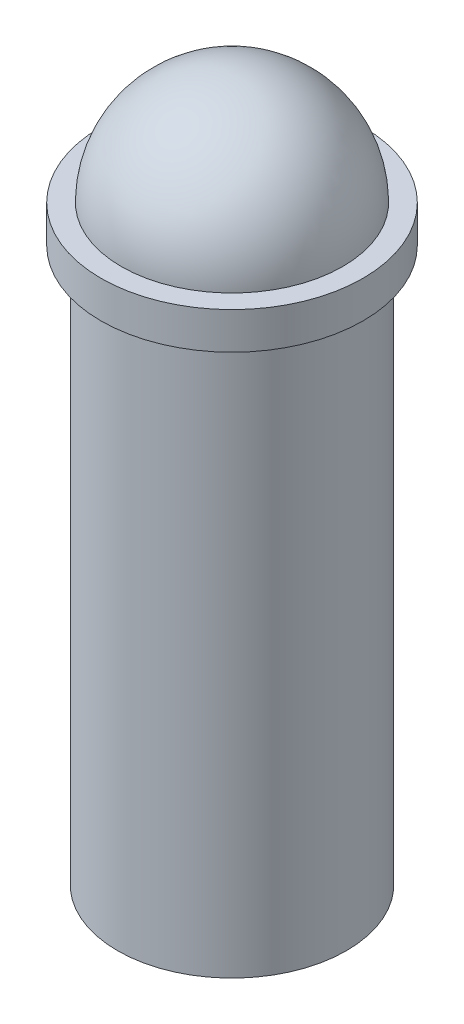
ISO-10303-21;
HEADER;
FILE_DESCRIPTION(('STEP AP214'),'2;1');
FILE_NAME('part.step','',(''),(''),'','','');
FILE_SCHEMA(('AUTOMOTIVE_DESIGN { 1 0 10303 214 1 1 1 1 }'));
ENDSEC;
DATA;
#1=APPLICATION_CONTEXT('core data for automotive mechanical design processes');
#2=APPLICATION_PROTOCOL_DEFINITION('international standard','automotive_design',2000,#1);
#3=PRODUCT_CONTEXT('',#1,'mechanical');
#4=PRODUCT('Part','Part','',(#3));
#5=PRODUCT_RELATED_PRODUCT_CATEGORY('part','',(#4));
#6=PRODUCT_DEFINITION_FORMATION('','',#4);
#7=PRODUCT_DEFINITION_CONTEXT('part definition',#1,'design');
#8=PRODUCT_DEFINITION('design','',#6,#7);
#9=PRODUCT_DEFINITION_SHAPE('','',#8);
#10=(LENGTH_UNIT() NAMED_UNIT(*) SI_UNIT(.MILLI.,.METRE.));
#11=(NAMED_UNIT(*) PLANE_ANGLE_UNIT() SI_UNIT($,.RADIAN.));
#12=(NAMED_UNIT(*) SI_UNIT($,.STERADIAN.) SOLID_ANGLE_UNIT());
#13=UNCERTAINTY_MEASURE_WITH_UNIT(LENGTH_MEASURE(1.E-05),#10,'distance_accuracy_value','');
#14=(GEOMETRIC_REPRESENTATION_CONTEXT(3) GLOBAL_UNCERTAINTY_ASSIGNED_CONTEXT((#13)) GLOBAL_UNIT_ASSIGNED_CONTEXT((#10,
#11,#12)) REPRESENTATION_CONTEXT('',''));
#15=CARTESIAN_POINT('',(0.,0.,0.));
#16=DIRECTION('',(0.,0.,1.));
#17=DIRECTION('',(1.,0.,0.));
#18=AXIS2_PLACEMENT_3D('',#15,#16,#17);
#19=CARTESIAN_POINT('',(0.,0.,0.));
#20=DIRECTION('',(0.,1.,0.));
#21=DIRECTION('',(0.,0.,1.));
#22=AXIS2_PLACEMENT_3D('',#19,#20,#21);
#23=PLANE('',#22);
#24=CARTESIAN_POINT('',(0.,0.,0.));
#25=DIRECTION('',(0.,1.,0.));
#26=DIRECTION('',(0.,0.,1.));
#27=AXIS2_PLACEMENT_3D('',#24,#25,#26);
#28=CIRCLE('',#27,3.55);
#29=CARTESIAN_POINT('',(0.,0.,3.55));
#30=VERTEX_POINT('',#29);
#31=EDGE_CURVE('E43',#30,#30,#28,.T.);
#32=ORIENTED_EDGE('',*,*,#31,.F.);
#33=EDGE_LOOP('',(#32));
#34=FACE_BOUND('',#33,.T.);
#35=CARTESIAN_POINT('',(0.,0.,0.));
#36=DIRECTION('',(0.,1.,0.));
#37=DIRECTION('',(0.,0.,1.));
#38=AXIS2_PLACEMENT_3D('',#35,#36,#37);
#39=CIRCLE('',#38,3.1);
#40=CARTESIAN_POINT('',(0.,0.,3.1));
#41=VERTEX_POINT('',#40);
#42=EDGE_CURVE('E10',#41,#41,#39,.F.);
#43=ORIENTED_EDGE('',*,*,#42,.F.);
#44=EDGE_LOOP('',(#43));
#45=FACE_BOUND('',#44,.T.);
#46=ADVANCED_FACE('F32',(#34,#45),#23,.F.);
#47=CARTESIAN_POINT('',(0.,1.,0.));
#48=DIRECTION('',(0.,1.,0.));
#49=DIRECTION('',(0.,0.,1.));
#50=AXIS2_PLACEMENT_3D('',#47,#48,#49);
#51=PLANE('',#50);
#52=CARTESIAN_POINT('',(0.,1.,0.));
#53=DIRECTION('',(0.,1.,0.));
#54=DIRECTION('',(0.,0.,1.));
#55=AXIS2_PLACEMENT_3D('',#52,#53,#54);
#56=CIRCLE('',#55,3.55);
#57=CARTESIAN_POINT('',(0.,1.,3.55));
#58=VERTEX_POINT('',#57);
#59=EDGE_CURVE('E39',#58,#58,#56,.T.);
#60=ORIENTED_EDGE('',*,*,#59,.T.);
#61=EDGE_LOOP('',(#60));
#62=FACE_BOUND('',#61,.T.);
#63=CARTESIAN_POINT('',(0.,1.,0.));
#64=DIRECTION('',(0.,1.,0.));
#65=DIRECTION('',(0.,0.,1.));
#66=AXIS2_PLACEMENT_3D('',#63,#64,#65);
#67=CIRCLE('',#66,3.);
#68=CARTESIAN_POINT('',(0.,1.,3.));
#69=VERTEX_POINT('',#68);
#70=EDGE_CURVE('E48',#69,#69,#67,.T.);
#71=ORIENTED_EDGE('',*,*,#70,.F.);
#72=EDGE_LOOP('',(#71));
#73=FACE_BOUND('',#72,.T.);
#74=ADVANCED_FACE('F70',(#62,#73),#51,.T.);
#75=CARTESIAN_POINT('',(0.,1.,0.));
#76=DIRECTION('',(0.,-1.,0.));
#77=DIRECTION('',(0.,0.,-1.));
#78=AXIS2_PLACEMENT_3D('',#75,#76,#77);
#79=CYLINDRICAL_SURFACE('',#78,3.55);
#80=ORIENTED_EDGE('',*,*,#59,.F.);
#81=EDGE_LOOP('',(#80));
#82=FACE_BOUND('',#81,.T.);
#83=ORIENTED_EDGE('',*,*,#31,.T.);
#84=EDGE_LOOP('',(#83));
#85=FACE_BOUND('',#84,.T.);
#86=ADVANCED_FACE('F34',(#82,#85),#79,.T.);
#87=CARTESIAN_POINT('',(0.,1.,0.));
#88=DIRECTION('',(0.,1.,0.));
#89=DIRECTION('',(0.,0.,-1.));
#90=AXIS2_PLACEMENT_3D('',#87,#88,#89);
#91=SPHERICAL_SURFACE('',#90,3.);
#92=ORIENTED_EDGE('',*,*,#70,.T.);
#93=EDGE_LOOP('',(#92));
#94=FACE_BOUND('',#93,.T.);
#95=ADVANCED_FACE('F60',(#94),#91,.T.);
#96=CARTESIAN_POINT('',(0.,-15.,0.));
#97=DIRECTION('',(0.,1.,0.));
#98=DIRECTION('',(0.,0.,1.));
#99=AXIS2_PLACEMENT_3D('',#96,#97,#98);
#100=CYLINDRICAL_SURFACE('',#99,3.1);
#101=CARTESIAN_POINT('',(0.,-15.,0.));
#102=DIRECTION('',(0.,-1.,0.));
#103=DIRECTION('',(0.,0.,-1.));
#104=AXIS2_PLACEMENT_3D('',#101,#102,#103);
#105=CIRCLE('',#104,3.1);
#106=CARTESIAN_POINT('',(0.,-15.,-3.1));
#107=VERTEX_POINT('',#106);
#108=EDGE_CURVE('E52',#107,#107,#105,.T.);
#109=ORIENTED_EDGE('',*,*,#108,.F.);
#110=EDGE_LOOP('',(#109));
#111=FACE_BOUND('',#110,.T.);
#112=ORIENTED_EDGE('',*,*,#42,.T.);
#113=EDGE_LOOP('',(#112));
#114=FACE_BOUND('',#113,.T.);
#115=ADVANCED_FACE('F58',(#111,#114),#100,.T.);
#116=CARTESIAN_POINT('',(0.,-15.,0.));
#117=DIRECTION('',(0.,-1.,0.));
#118=DIRECTION('',(0.,0.,-1.));
#119=AXIS2_PLACEMENT_3D('',#116,#117,#118);
#120=PLANE('',#119);
#121=ORIENTED_EDGE('',*,*,#108,.T.);
#122=EDGE_LOOP('',(#121));
#123=FACE_BOUND('',#122,.T.);
#124=ADVANCED_FACE('F56',(#123),#120,.T.);
#125=CLOSED_SHELL('',(#46,#74,#86,#95,#115,#124));
#126=MANIFOLD_SOLID_BREP('B2',#125);
#127=ADVANCED_BREP_SHAPE_REPRESENTATION('',(#18,#126),#14);
#128=SHAPE_DEFINITION_REPRESENTATION(#9,#127);
ENDSEC;
END-ISO-10303-21;
